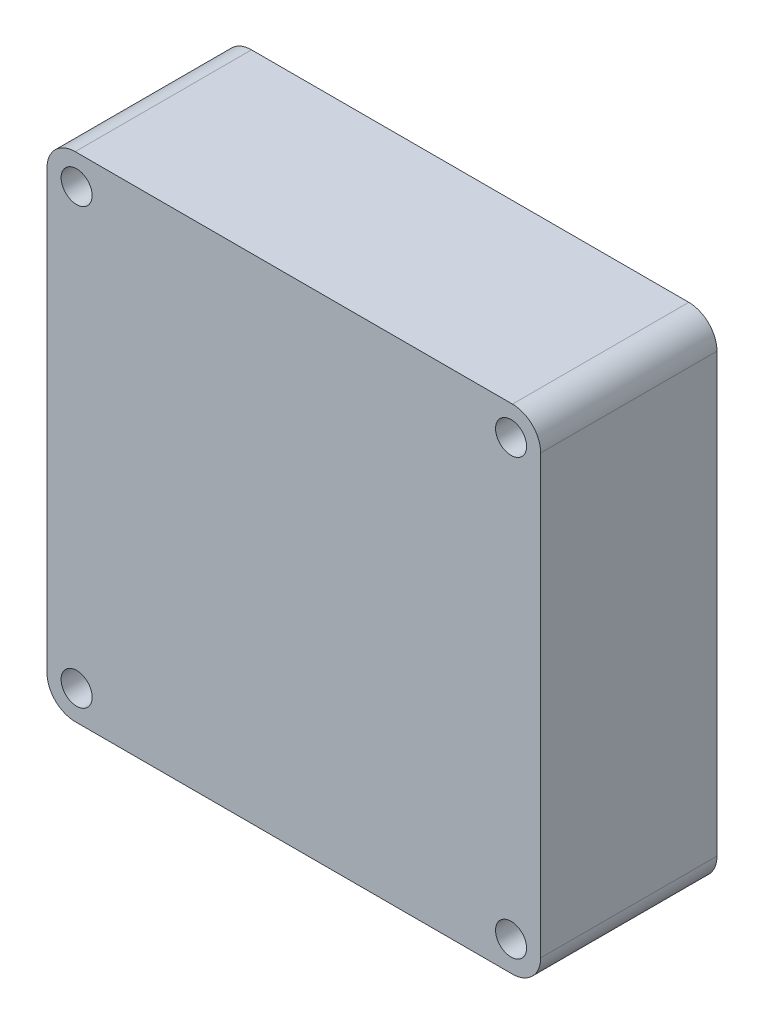
ISO-10303-21;
HEADER;
FILE_DESCRIPTION(('STEP AP214'),'2;1');
FILE_NAME('part.step','',(''),(''),'','','');
FILE_SCHEMA(('AUTOMOTIVE_DESIGN { 1 0 10303 214 1 1 1 1 }'));
ENDSEC;
DATA;
#1=APPLICATION_CONTEXT('core data for automotive mechanical design processes');
#2=APPLICATION_PROTOCOL_DEFINITION('international standard','automotive_design',2000,#1);
#3=PRODUCT_CONTEXT('',#1,'mechanical');
#4=PRODUCT('Part','Part','',(#3));
#5=PRODUCT_RELATED_PRODUCT_CATEGORY('part','',(#4));
#6=PRODUCT_DEFINITION_FORMATION('','',#4);
#7=PRODUCT_DEFINITION_CONTEXT('part definition',#1,'design');
#8=PRODUCT_DEFINITION('design','',#6,#7);
#9=PRODUCT_DEFINITION_SHAPE('','',#8);
#10=(LENGTH_UNIT() NAMED_UNIT(*) SI_UNIT(.MILLI.,.METRE.));
#11=(NAMED_UNIT(*) PLANE_ANGLE_UNIT() SI_UNIT($,.RADIAN.));
#12=(NAMED_UNIT(*) SI_UNIT($,.STERADIAN.) SOLID_ANGLE_UNIT());
#13=UNCERTAINTY_MEASURE_WITH_UNIT(LENGTH_MEASURE(1.E-05),#10,'distance_accuracy_value','');
#14=(GEOMETRIC_REPRESENTATION_CONTEXT(3) GLOBAL_UNCERTAINTY_ASSIGNED_CONTEXT((#13)) GLOBAL_UNIT_ASSIGNED_CONTEXT((#10,
#11,#12)) REPRESENTATION_CONTEXT('',''));
#15=CARTESIAN_POINT('',(0.,0.,0.));
#16=DIRECTION('',(0.,0.,1.));
#17=DIRECTION('',(1.,0.,0.));
#18=AXIS2_PLACEMENT_3D('',#15,#16,#17);
#19=CARTESIAN_POINT('',(35.,-35.,25.));
#20=DIRECTION('',(-1.,0.,0.));
#21=DIRECTION('',(0.,0.,1.));
#22=AXIS2_PLACEMENT_3D('',#19,#20,#21);
#23=PLANE('',#22);
#24=DIRECTION('',(0.,1.,0.));
#25=VECTOR('',#24,1.);
#26=CARTESIAN_POINT('',(35.,-35.,25.));
#27=LINE('',#26,#25);
#28=CARTESIAN_POINT('',(35.,-31.,25.));
#29=VERTEX_POINT('',#28);
#30=CARTESIAN_POINT('',(35.,31.,25.));
#31=VERTEX_POINT('',#30);
#32=EDGE_CURVE('E131',#29,#31,#27,.T.);
#33=ORIENTED_EDGE('',*,*,#32,.F.);
#34=DIRECTION('',(0.,0.,-1.));
#35=VECTOR('',#34,1.);
#36=CARTESIAN_POINT('',(35.,-31.,25.));
#37=LINE('',#36,#35);
#38=CARTESIAN_POINT('',(35.,-31.,0.));
#39=VERTEX_POINT('',#38);
#40=EDGE_CURVE('E115',#29,#39,#37,.T.);
#41=ORIENTED_EDGE('',*,*,#40,.T.);
#42=DIRECTION('',(0.,1.,0.));
#43=VECTOR('',#42,1.);
#44=CARTESIAN_POINT('',(35.,-35.,0.));
#45=LINE('',#44,#43);
#46=CARTESIAN_POINT('',(35.,31.,0.));
#47=VERTEX_POINT('',#46);
#48=EDGE_CURVE('E128',#39,#47,#45,.T.);
#49=ORIENTED_EDGE('',*,*,#48,.T.);
#50=DIRECTION('',(0.,0.,-1.));
#51=VECTOR('',#50,1.);
#52=CARTESIAN_POINT('',(35.,31.,25.));
#53=LINE('',#52,#51);
#54=EDGE_CURVE('E134',#47,#31,#53,.F.);
#55=ORIENTED_EDGE('',*,*,#54,.T.);
#56=EDGE_LOOP('',(#33,#41,#49,#55));
#57=FACE_BOUND('',#56,.T.);
#58=ADVANCED_FACE('F45',(#57),#23,.F.);
#59=CARTESIAN_POINT('',(-35.,35.,25.));
#60=DIRECTION('',(0.,-1.,0.));
#61=DIRECTION('',(0.,0.,-1.));
#62=AXIS2_PLACEMENT_3D('',#59,#60,#61);
#63=PLANE('',#62);
#64=DIRECTION('',(-1.,0.,0.));
#65=VECTOR('',#64,1.);
#66=CARTESIAN_POINT('',(-35.,35.,25.));
#67=LINE('',#66,#65);
#68=CARTESIAN_POINT('',(31.,35.,25.));
#69=VERTEX_POINT('',#68);
#70=CARTESIAN_POINT('',(-31.,35.,25.));
#71=VERTEX_POINT('',#70);
#72=EDGE_CURVE('E207',#69,#71,#67,.T.);
#73=ORIENTED_EDGE('',*,*,#72,.F.);
#74=DIRECTION('',(0.,0.,-1.));
#75=VECTOR('',#74,1.);
#76=CARTESIAN_POINT('',(31.,35.,25.));
#77=LINE('',#76,#75);
#78=CARTESIAN_POINT('',(31.,35.,0.));
#79=VERTEX_POINT('',#78);
#80=EDGE_CURVE('E187',#69,#79,#77,.T.);
#81=ORIENTED_EDGE('',*,*,#80,.T.);
#82=DIRECTION('',(-1.,0.,0.));
#83=VECTOR('',#82,1.);
#84=CARTESIAN_POINT('',(-35.,35.,0.));
#85=LINE('',#84,#83);
#86=CARTESIAN_POINT('',(-31.,35.,0.));
#87=VERTEX_POINT('',#86);
#88=EDGE_CURVE('E139',#79,#87,#85,.T.);
#89=ORIENTED_EDGE('',*,*,#88,.T.);
#90=DIRECTION('',(0.,0.,-1.));
#91=VECTOR('',#90,1.);
#92=CARTESIAN_POINT('',(-31.,35.,25.));
#93=LINE('',#92,#91);
#94=EDGE_CURVE('E184',#87,#71,#93,.F.);
#95=ORIENTED_EDGE('',*,*,#94,.T.);
#96=EDGE_LOOP('',(#73,#81,#89,#95));
#97=FACE_BOUND('',#96,.T.);
#98=ADVANCED_FACE('F269',(#97),#63,.F.);
#99=CARTESIAN_POINT('',(-35.,-35.,25.));
#100=DIRECTION('',(1.,0.,0.));
#101=DIRECTION('',(0.,0.,-1.));
#102=AXIS2_PLACEMENT_3D('',#99,#100,#101);
#103=PLANE('',#102);
#104=DIRECTION('',(0.,-1.,0.));
#105=VECTOR('',#104,1.);
#106=CARTESIAN_POINT('',(-35.,-35.,0.));
#107=LINE('',#106,#105);
#108=CARTESIAN_POINT('',(-35.,31.,0.));
#109=VERTEX_POINT('',#108);
#110=CARTESIAN_POINT('',(-35.,-31.,0.));
#111=VERTEX_POINT('',#110);
#112=EDGE_CURVE('E145',#109,#111,#107,.T.);
#113=ORIENTED_EDGE('',*,*,#112,.T.);
#114=DIRECTION('',(0.,0.,-1.));
#115=VECTOR('',#114,1.);
#116=CARTESIAN_POINT('',(-35.,-31.,25.));
#117=LINE('',#116,#115);
#118=CARTESIAN_POINT('',(-35.,-31.,25.));
#119=VERTEX_POINT('',#118);
#120=EDGE_CURVE('E11',#111,#119,#117,.F.);
#121=ORIENTED_EDGE('',*,*,#120,.T.);
#122=DIRECTION('',(0.,-1.,0.));
#123=VECTOR('',#122,1.);
#124=CARTESIAN_POINT('',(-35.,-35.,25.));
#125=LINE('',#124,#123);
#126=CARTESIAN_POINT('',(-35.,31.,25.));
#127=VERTEX_POINT('',#126);
#128=EDGE_CURVE('E195',#127,#119,#125,.T.);
#129=ORIENTED_EDGE('',*,*,#128,.F.);
#130=DIRECTION('',(0.,0.,-1.));
#131=VECTOR('',#130,1.);
#132=CARTESIAN_POINT('',(-35.,31.,25.));
#133=LINE('',#132,#131);
#134=EDGE_CURVE('E54',#127,#109,#133,.T.);
#135=ORIENTED_EDGE('',*,*,#134,.T.);
#136=EDGE_LOOP('',(#113,#121,#129,#135));
#137=FACE_BOUND('',#136,.T.);
#138=ADVANCED_FACE('F194',(#137),#103,.F.);
#139=CARTESIAN_POINT('',(-35.,-35.,25.));
#140=DIRECTION('',(0.,1.,0.));
#141=DIRECTION('',(0.,0.,1.));
#142=AXIS2_PLACEMENT_3D('',#139,#140,#141);
#143=PLANE('',#142);
#144=DIRECTION('',(1.,0.,0.));
#145=VECTOR('',#144,1.);
#146=CARTESIAN_POINT('',(-35.,-35.,0.));
#147=LINE('',#146,#145);
#148=CARTESIAN_POINT('',(-31.,-35.,0.));
#149=VERTEX_POINT('',#148);
#150=CARTESIAN_POINT('',(31.,-35.,0.));
#151=VERTEX_POINT('',#150);
#152=EDGE_CURVE('E156',#149,#151,#147,.T.);
#153=ORIENTED_EDGE('',*,*,#152,.T.);
#154=DIRECTION('',(0.,0.,-1.));
#155=VECTOR('',#154,1.);
#156=CARTESIAN_POINT('',(31.,-35.,25.));
#157=LINE('',#156,#155);
#158=CARTESIAN_POINT('',(31.,-35.,25.));
#159=VERTEX_POINT('',#158);
#160=EDGE_CURVE('E116',#151,#159,#157,.F.);
#161=ORIENTED_EDGE('',*,*,#160,.T.);
#162=DIRECTION('',(1.,0.,0.));
#163=VECTOR('',#162,1.);
#164=CARTESIAN_POINT('',(-35.,-35.,25.));
#165=LINE('',#164,#163);
#166=CARTESIAN_POINT('',(-31.,-35.,25.));
#167=VERTEX_POINT('',#166);
#168=EDGE_CURVE('E151',#167,#159,#165,.T.);
#169=ORIENTED_EDGE('',*,*,#168,.F.);
#170=DIRECTION('',(0.,0.,-1.));
#171=VECTOR('',#170,1.);
#172=CARTESIAN_POINT('',(-31.,-35.,25.));
#173=LINE('',#172,#171);
#174=EDGE_CURVE('E122',#167,#149,#173,.T.);
#175=ORIENTED_EDGE('',*,*,#174,.T.);
#176=EDGE_LOOP('',(#153,#161,#169,#175));
#177=FACE_BOUND('',#176,.T.);
#178=ADVANCED_FACE('F203',(#177),#143,.F.);
#179=CARTESIAN_POINT('',(0.,0.,25.));
#180=DIRECTION('',(0.,0.,-1.));
#181=DIRECTION('',(-1.,0.,0.));
#182=AXIS2_PLACEMENT_3D('',#179,#180,#181);
#183=PLANE('',#182);
#184=CARTESIAN_POINT('',(-30.8,-30.8,25.));
#185=DIRECTION('',(0.,0.,1.));
#186=DIRECTION('',(1.,0.,0.));
#187=AXIS2_PLACEMENT_3D('',#184,#185,#186);
#188=CIRCLE('',#187,2.2);
#189=CARTESIAN_POINT('',(-28.6,-30.8,25.));
#190=VERTEX_POINT('',#189);
#191=EDGE_CURVE('E217',#190,#190,#188,.T.);
#192=ORIENTED_EDGE('',*,*,#191,.F.);
#193=EDGE_LOOP('',(#192));
#194=FACE_BOUND('',#193,.T.);
#195=CARTESIAN_POINT('',(30.8,-30.8,25.));
#196=DIRECTION('',(0.,0.,1.));
#197=DIRECTION('',(1.,0.,0.));
#198=AXIS2_PLACEMENT_3D('',#195,#196,#197);
#199=CIRCLE('',#198,2.2);
#200=CARTESIAN_POINT('',(33.,-30.8,25.));
#201=VERTEX_POINT('',#200);
#202=EDGE_CURVE('E225',#201,#201,#199,.T.);
#203=ORIENTED_EDGE('',*,*,#202,.F.);
#204=EDGE_LOOP('',(#203));
#205=FACE_BOUND('',#204,.T.);
#206=CARTESIAN_POINT('',(30.8,30.8,25.));
#207=DIRECTION('',(0.,0.,1.));
#208=DIRECTION('',(1.,0.,0.));
#209=AXIS2_PLACEMENT_3D('',#206,#207,#208);
#210=CIRCLE('',#209,2.2);
#211=CARTESIAN_POINT('',(33.,30.8,25.));
#212=VERTEX_POINT('',#211);
#213=EDGE_CURVE('E233',#212,#212,#210,.T.);
#214=ORIENTED_EDGE('',*,*,#213,.F.);
#215=EDGE_LOOP('',(#214));
#216=FACE_BOUND('',#215,.T.);
#217=CARTESIAN_POINT('',(-30.8,30.8,25.));
#218=DIRECTION('',(0.,0.,1.));
#219=DIRECTION('',(1.,0.,0.));
#220=AXIS2_PLACEMENT_3D('',#217,#218,#219);
#221=CIRCLE('',#220,2.2);
#222=CARTESIAN_POINT('',(-28.6,30.8,25.));
#223=VERTEX_POINT('',#222);
#224=EDGE_CURVE('E148',#223,#223,#221,.T.);
#225=ORIENTED_EDGE('',*,*,#224,.F.);
#226=EDGE_LOOP('',(#225));
#227=FACE_BOUND('',#226,.T.);
#228=ORIENTED_EDGE('',*,*,#168,.T.);
#229=CARTESIAN_POINT('',(31.,-31.,25.));
#230=DIRECTION('',(0.,0.,-1.));
#231=DIRECTION('',(-1.,0.,0.));
#232=AXIS2_PLACEMENT_3D('',#229,#230,#231);
#233=CIRCLE('',#232,4.);
#234=EDGE_CURVE('E181',#159,#29,#233,.F.);
#235=ORIENTED_EDGE('',*,*,#234,.T.);
#236=ORIENTED_EDGE('',*,*,#32,.T.);
#237=CARTESIAN_POINT('',(31.,31.,25.));
#238=DIRECTION('',(0.,0.,-1.));
#239=DIRECTION('',(-1.,0.,0.));
#240=AXIS2_PLACEMENT_3D('',#237,#238,#239);
#241=CIRCLE('',#240,4.);
#242=EDGE_CURVE('E178',#31,#69,#241,.F.);
#243=ORIENTED_EDGE('',*,*,#242,.T.);
#244=ORIENTED_EDGE('',*,*,#72,.T.);
#245=CARTESIAN_POINT('',(-31.,31.,25.));
#246=DIRECTION('',(0.,0.,-1.));
#247=DIRECTION('',(-1.,0.,0.));
#248=AXIS2_PLACEMENT_3D('',#245,#246,#247);
#249=CIRCLE('',#248,4.);
#250=EDGE_CURVE('E66',#71,#127,#249,.F.);
#251=ORIENTED_EDGE('',*,*,#250,.T.);
#252=ORIENTED_EDGE('',*,*,#128,.T.);
#253=CARTESIAN_POINT('',(-31.,-31.,25.));
#254=DIRECTION('',(0.,0.,-1.));
#255=DIRECTION('',(-1.,0.,0.));
#256=AXIS2_PLACEMENT_3D('',#253,#254,#255);
#257=CIRCLE('',#256,4.);
#258=EDGE_CURVE('E175',#119,#167,#257,.F.);
#259=ORIENTED_EDGE('',*,*,#258,.T.);
#260=EDGE_LOOP('',(#228,#235,#236,#243,#244,#251,#252,#259));
#261=FACE_BOUND('',#260,.T.);
#262=ADVANCED_FACE('F251',(#194,#205,#216,#227,#261),#183,.F.);
#263=CARTESIAN_POINT('',(0.,0.,0.));
#264=DIRECTION('',(0.,0.,-1.));
#265=DIRECTION('',(-1.,0.,0.));
#266=AXIS2_PLACEMENT_3D('',#263,#264,#265);
#267=PLANE('',#266);
#268=CARTESIAN_POINT('',(-30.8,-30.8,0.));
#269=DIRECTION('',(0.,0.,1.));
#270=DIRECTION('',(1.,0.,0.));
#271=AXIS2_PLACEMENT_3D('',#268,#269,#270);
#272=CIRCLE('',#271,2.2);
#273=CARTESIAN_POINT('',(-28.6,-30.8,0.));
#274=VERTEX_POINT('',#273);
#275=EDGE_CURVE('E221',#274,#274,#272,.T.);
#276=ORIENTED_EDGE('',*,*,#275,.T.);
#277=EDGE_LOOP('',(#276));
#278=FACE_BOUND('',#277,.T.);
#279=CARTESIAN_POINT('',(30.8,-30.8,0.));
#280=DIRECTION('',(0.,0.,1.));
#281=DIRECTION('',(1.,0.,0.));
#282=AXIS2_PLACEMENT_3D('',#279,#280,#281);
#283=CIRCLE('',#282,2.2);
#284=CARTESIAN_POINT('',(33.,-30.8,0.));
#285=VERTEX_POINT('',#284);
#286=EDGE_CURVE('E229',#285,#285,#283,.T.);
#287=ORIENTED_EDGE('',*,*,#286,.T.);
#288=EDGE_LOOP('',(#287));
#289=FACE_BOUND('',#288,.T.);
#290=CARTESIAN_POINT('',(30.8,30.8,0.));
#291=DIRECTION('',(0.,0.,1.));
#292=DIRECTION('',(1.,0.,0.));
#293=AXIS2_PLACEMENT_3D('',#290,#291,#292);
#294=CIRCLE('',#293,2.2);
#295=CARTESIAN_POINT('',(33.,30.8,0.));
#296=VERTEX_POINT('',#295);
#297=EDGE_CURVE('E215',#296,#296,#294,.T.);
#298=ORIENTED_EDGE('',*,*,#297,.T.);
#299=EDGE_LOOP('',(#298));
#300=FACE_BOUND('',#299,.T.);
#301=CARTESIAN_POINT('',(-30.8,30.8,0.));
#302=DIRECTION('',(0.,0.,1.));
#303=DIRECTION('',(1.,0.,0.));
#304=AXIS2_PLACEMENT_3D('',#301,#302,#303);
#305=CIRCLE('',#304,2.2);
#306=CARTESIAN_POINT('',(-28.6,30.8,0.));
#307=VERTEX_POINT('',#306);
#308=EDGE_CURVE('E140',#307,#307,#305,.T.);
#309=ORIENTED_EDGE('',*,*,#308,.T.);
#310=EDGE_LOOP('',(#309));
#311=FACE_BOUND('',#310,.T.);
#312=ORIENTED_EDGE('',*,*,#48,.F.);
#313=CARTESIAN_POINT('',(31.,-31.,0.));
#314=DIRECTION('',(0.,0.,-1.));
#315=DIRECTION('',(-1.,0.,0.));
#316=AXIS2_PLACEMENT_3D('',#313,#314,#315);
#317=CIRCLE('',#316,4.);
#318=EDGE_CURVE('E111',#39,#151,#317,.T.);
#319=ORIENTED_EDGE('',*,*,#318,.T.);
#320=ORIENTED_EDGE('',*,*,#152,.F.);
#321=CARTESIAN_POINT('',(-31.,-31.,0.));
#322=DIRECTION('',(0.,0.,-1.));
#323=DIRECTION('',(-1.,0.,0.));
#324=AXIS2_PLACEMENT_3D('',#321,#322,#323);
#325=CIRCLE('',#324,4.);
#326=EDGE_CURVE('E163',#149,#111,#325,.T.);
#327=ORIENTED_EDGE('',*,*,#326,.T.);
#328=ORIENTED_EDGE('',*,*,#112,.F.);
#329=CARTESIAN_POINT('',(-31.,31.,0.));
#330=DIRECTION('',(0.,0.,-1.));
#331=DIRECTION('',(-1.,0.,0.));
#332=AXIS2_PLACEMENT_3D('',#329,#330,#331);
#333=CIRCLE('',#332,4.);
#334=EDGE_CURVE('E133',#109,#87,#333,.T.);
#335=ORIENTED_EDGE('',*,*,#334,.T.);
#336=ORIENTED_EDGE('',*,*,#88,.F.);
#337=CARTESIAN_POINT('',(31.,31.,0.));
#338=DIRECTION('',(0.,0.,-1.));
#339=DIRECTION('',(-1.,0.,0.));
#340=AXIS2_PLACEMENT_3D('',#337,#338,#339);
#341=CIRCLE('',#340,4.);
#342=EDGE_CURVE('E123',#79,#47,#341,.T.);
#343=ORIENTED_EDGE('',*,*,#342,.T.);
#344=EDGE_LOOP('',(#312,#319,#320,#327,#328,#335,#336,#343));
#345=FACE_BOUND('',#344,.T.);
#346=ADVANCED_FACE('F136',(#278,#289,#300,#311,#345),#267,.T.);
#347=CARTESIAN_POINT('',(-30.8,30.8,0.));
#348=DIRECTION('',(0.,0.,1.));
#349=DIRECTION('',(1.,0.,0.));
#350=AXIS2_PLACEMENT_3D('',#347,#348,#349);
#351=CYLINDRICAL_SURFACE('',#350,2.2);
#352=ORIENTED_EDGE('',*,*,#308,.F.);
#353=EDGE_LOOP('',(#352));
#354=FACE_BOUND('',#353,.T.);
#355=ORIENTED_EDGE('',*,*,#224,.T.);
#356=EDGE_LOOP('',(#355));
#357=FACE_BOUND('',#356,.T.);
#358=ADVANCED_FACE('F247',(#354,#357),#351,.F.);
#359=CARTESIAN_POINT('',(30.8,30.8,0.));
#360=DIRECTION('',(0.,0.,1.));
#361=DIRECTION('',(1.,0.,0.));
#362=AXIS2_PLACEMENT_3D('',#359,#360,#361);
#363=CYLINDRICAL_SURFACE('',#362,2.2);
#364=ORIENTED_EDGE('',*,*,#297,.F.);
#365=EDGE_LOOP('',(#364));
#366=FACE_BOUND('',#365,.T.);
#367=ORIENTED_EDGE('',*,*,#213,.T.);
#368=EDGE_LOOP('',(#367));
#369=FACE_BOUND('',#368,.T.);
#370=ADVANCED_FACE('F243',(#366,#369),#363,.F.);
#371=CARTESIAN_POINT('',(30.8,-30.8,0.));
#372=DIRECTION('',(0.,0.,1.));
#373=DIRECTION('',(1.,0.,0.));
#374=AXIS2_PLACEMENT_3D('',#371,#372,#373);
#375=CYLINDRICAL_SURFACE('',#374,2.2);
#376=ORIENTED_EDGE('',*,*,#286,.F.);
#377=EDGE_LOOP('',(#376));
#378=FACE_BOUND('',#377,.T.);
#379=ORIENTED_EDGE('',*,*,#202,.T.);
#380=EDGE_LOOP('',(#379));
#381=FACE_BOUND('',#380,.T.);
#382=ADVANCED_FACE('F246',(#378,#381),#375,.F.);
#383=CARTESIAN_POINT('',(-30.8,-30.8,0.));
#384=DIRECTION('',(0.,0.,1.));
#385=DIRECTION('',(1.,0.,0.));
#386=AXIS2_PLACEMENT_3D('',#383,#384,#385);
#387=CYLINDRICAL_SURFACE('',#386,2.2);
#388=ORIENTED_EDGE('',*,*,#275,.F.);
#389=EDGE_LOOP('',(#388));
#390=FACE_BOUND('',#389,.T.);
#391=ORIENTED_EDGE('',*,*,#191,.T.);
#392=EDGE_LOOP('',(#391));
#393=FACE_BOUND('',#392,.T.);
#394=ADVANCED_FACE('F282',(#390,#393),#387,.F.);
#395=CARTESIAN_POINT('',(31.,-31.,25.));
#396=DIRECTION('',(0.,0.,-1.));
#397=DIRECTION('',(-1.,0.,0.));
#398=AXIS2_PLACEMENT_3D('',#395,#396,#397);
#399=CYLINDRICAL_SURFACE('',#398,4.);
#400=ORIENTED_EDGE('',*,*,#234,.F.);
#401=ORIENTED_EDGE('',*,*,#160,.F.);
#402=ORIENTED_EDGE('',*,*,#318,.F.);
#403=ORIENTED_EDGE('',*,*,#40,.F.);
#404=EDGE_LOOP('',(#400,#401,#402,#403));
#405=FACE_BOUND('',#404,.T.);
#406=ADVANCED_FACE('F114',(#405),#399,.T.);
#407=CARTESIAN_POINT('',(31.,31.,25.));
#408=DIRECTION('',(0.,0.,-1.));
#409=DIRECTION('',(-1.,0.,0.));
#410=AXIS2_PLACEMENT_3D('',#407,#408,#409);
#411=CYLINDRICAL_SURFACE('',#410,4.);
#412=ORIENTED_EDGE('',*,*,#242,.F.);
#413=ORIENTED_EDGE('',*,*,#54,.F.);
#414=ORIENTED_EDGE('',*,*,#342,.F.);
#415=ORIENTED_EDGE('',*,*,#80,.F.);
#416=EDGE_LOOP('',(#412,#413,#414,#415));
#417=FACE_BOUND('',#416,.T.);
#418=ADVANCED_FACE('F281',(#417),#411,.T.);
#419=CARTESIAN_POINT('',(-31.,-31.,25.));
#420=DIRECTION('',(0.,0.,-1.));
#421=DIRECTION('',(-1.,0.,0.));
#422=AXIS2_PLACEMENT_3D('',#419,#420,#421);
#423=CYLINDRICAL_SURFACE('',#422,4.);
#424=ORIENTED_EDGE('',*,*,#258,.F.);
#425=ORIENTED_EDGE('',*,*,#120,.F.);
#426=ORIENTED_EDGE('',*,*,#326,.F.);
#427=ORIENTED_EDGE('',*,*,#174,.F.);
#428=EDGE_LOOP('',(#424,#425,#426,#427));
#429=FACE_BOUND('',#428,.T.);
#430=ADVANCED_FACE('F200',(#429),#423,.T.);
#431=CARTESIAN_POINT('',(-31.,31.,25.));
#432=DIRECTION('',(0.,0.,-1.));
#433=DIRECTION('',(-1.,0.,0.));
#434=AXIS2_PLACEMENT_3D('',#431,#432,#433);
#435=CYLINDRICAL_SURFACE('',#434,4.);
#436=ORIENTED_EDGE('',*,*,#250,.F.);
#437=ORIENTED_EDGE('',*,*,#94,.F.);
#438=ORIENTED_EDGE('',*,*,#334,.F.);
#439=ORIENTED_EDGE('',*,*,#134,.F.);
#440=EDGE_LOOP('',(#436,#437,#438,#439));
#441=FACE_BOUND('',#440,.T.);
#442=ADVANCED_FACE('F47',(#441),#435,.T.);
#443=CLOSED_SHELL('',(#58,#98,#138,#178,#262,#346,#358,#370,#382,#394,#406,#418,#430,#442));
#444=MANIFOLD_SOLID_BREP('B2',#443);
#445=ADVANCED_BREP_SHAPE_REPRESENTATION('',(#18,#444),#14);
#446=SHAPE_DEFINITION_REPRESENTATION(#9,#445);
ENDSEC;
END-ISO-10303-21;
